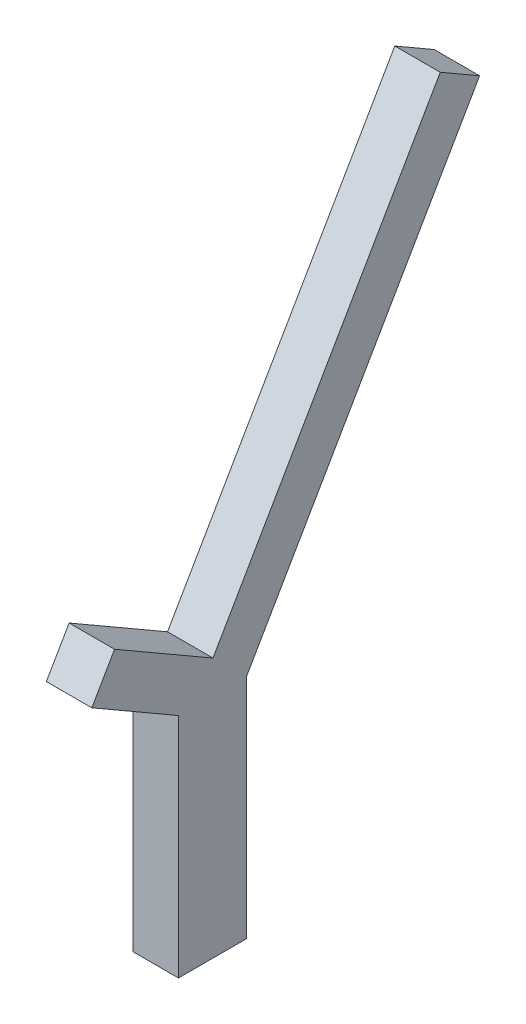
ISO-10303-21;
HEADER;
FILE_DESCRIPTION(('STEP AP214'),'2;1');
FILE_NAME('part.step','',(''),(''),'','','');
FILE_SCHEMA(('AUTOMOTIVE_DESIGN { 1 0 10303 214 1 1 1 1 }'));
ENDSEC;
DATA;
#1=APPLICATION_CONTEXT('core data for automotive mechanical design processes');
#2=APPLICATION_PROTOCOL_DEFINITION('international standard','automotive_design',2000,#1);
#3=PRODUCT_CONTEXT('',#1,'mechanical');
#4=PRODUCT('Part','Part','',(#3));
#5=PRODUCT_RELATED_PRODUCT_CATEGORY('part','',(#4));
#6=PRODUCT_DEFINITION_FORMATION('','',#4);
#7=PRODUCT_DEFINITION_CONTEXT('part definition',#1,'design');
#8=PRODUCT_DEFINITION('design','',#6,#7);
#9=PRODUCT_DEFINITION_SHAPE('','',#8);
#10=(LENGTH_UNIT() NAMED_UNIT(*) SI_UNIT(.MILLI.,.METRE.));
#11=(NAMED_UNIT(*) PLANE_ANGLE_UNIT() SI_UNIT($,.RADIAN.));
#12=(NAMED_UNIT(*) SI_UNIT($,.STERADIAN.) SOLID_ANGLE_UNIT());
#13=UNCERTAINTY_MEASURE_WITH_UNIT(LENGTH_MEASURE(1.E-05),#10,'distance_accuracy_value','');
#14=(GEOMETRIC_REPRESENTATION_CONTEXT(3) GLOBAL_UNCERTAINTY_ASSIGNED_CONTEXT((#13)) GLOBAL_UNIT_ASSIGNED_CONTEXT((#10,
#11,#12)) REPRESENTATION_CONTEXT('',''));
#15=CARTESIAN_POINT('',(0.,0.,0.));
#16=DIRECTION('',(0.,0.,1.));
#17=DIRECTION('',(1.,0.,0.));
#18=AXIS2_PLACEMENT_3D('',#15,#16,#17);
#19=CARTESIAN_POINT('',(10.,71.2768013397686,-49.277419261171));
#20=DIRECTION('',(0.,-0.86602540378444,0.499999999999998));
#21=DIRECTION('',(0.,-0.499999999999998,-0.86602540378444));
#22=AXIS2_PLACEMENT_3D('',#19,#20,#21);
#23=PLANE('',#22);
#24=DIRECTION('',(0.,0.499999999999998,0.86602540378444));
#25=VECTOR('',#24,1.);
#26=CARTESIAN_POINT('',(0.,71.2768013397686,-49.277419261171));
#27=LINE('',#26,#25);
#28=CARTESIAN_POINT('',(0.,71.2768013397686,-49.277419261171));
#29=VERTEX_POINT('',#28);
#30=CARTESIAN_POINT('',(0.,76.2768013397686,-40.6171652233266));
#31=VERTEX_POINT('',#30);
#32=EDGE_CURVE('E141',#29,#31,#27,.T.);
#33=ORIENTED_EDGE('',*,*,#32,.T.);
#34=DIRECTION('',(-1.,0.,0.));
#35=VECTOR('',#34,1.);
#36=CARTESIAN_POINT('',(10.,76.2768013397686,-40.6171652233266));
#37=LINE('',#36,#35);
#38=CARTESIAN_POINT('',(10.,76.2768013397686,-40.6171652233266));
#39=VERTEX_POINT('',#38);
#40=EDGE_CURVE('E11',#39,#31,#37,.T.);
#41=ORIENTED_EDGE('',*,*,#40,.F.);
#42=DIRECTION('',(0.,0.499999999999998,0.86602540378444));
#43=VECTOR('',#42,1.);
#44=CARTESIAN_POINT('',(10.,71.2768013397686,-49.277419261171));
#45=LINE('',#44,#43);
#46=CARTESIAN_POINT('',(10.,71.2768013397686,-49.277419261171));
#47=VERTEX_POINT('',#46);
#48=EDGE_CURVE('E157',#47,#39,#45,.T.);
#49=ORIENTED_EDGE('',*,*,#48,.F.);
#50=DIRECTION('',(-1.,0.,0.));
#51=VECTOR('',#50,1.);
#52=CARTESIAN_POINT('',(10.,71.2768013397686,-49.277419261171));
#53=LINE('',#52,#51);
#54=EDGE_CURVE('E137',#47,#29,#53,.T.);
#55=ORIENTED_EDGE('',*,*,#54,.T.);
#56=EDGE_LOOP('',(#33,#41,#49,#55));
#57=FACE_BOUND('',#56,.T.);
#58=ADVANCED_FACE('F39',(#57),#23,.F.);
#59=CARTESIAN_POINT('',(10.,76.2768013397686,-40.6171652233266));
#60=DIRECTION('',(0.,-0.499999999999997,-0.86602540378444));
#61=DIRECTION('',(0.,0.86602540378444,-0.499999999999997));
#62=AXIS2_PLACEMENT_3D('',#59,#60,#61);
#63=PLANE('',#62);
#64=DIRECTION('',(0.,-0.86602540378444,0.499999999999997));
#65=VECTOR('',#64,1.);
#66=CARTESIAN_POINT('',(0.,76.2768013397686,-40.6171652233266));
#67=LINE('',#66,#65);
#68=CARTESIAN_POINT('',(0.,-10.3257390386755,9.38283477667315));
#69=VERTEX_POINT('',#68);
#70=EDGE_CURVE('E144',#31,#69,#67,.T.);
#71=ORIENTED_EDGE('',*,*,#70,.T.);
#72=DIRECTION('',(-1.,0.,0.));
#73=VECTOR('',#72,1.);
#74=CARTESIAN_POINT('',(10.,-10.3257390386755,9.38283477667315));
#75=LINE('',#74,#73);
#76=CARTESIAN_POINT('',(10.,-10.3257390386755,9.38283477667315));
#77=VERTEX_POINT('',#76);
#78=EDGE_CURVE('E47',#77,#69,#75,.T.);
#79=ORIENTED_EDGE('',*,*,#78,.F.);
#80=DIRECTION('',(0.,-0.86602540378444,0.499999999999997));
#81=VECTOR('',#80,1.);
#82=CARTESIAN_POINT('',(10.,76.2768013397686,-40.6171652233266));
#83=LINE('',#82,#81);
#84=EDGE_CURVE('E101',#39,#77,#83,.T.);
#85=ORIENTED_EDGE('',*,*,#84,.F.);
#86=ORIENTED_EDGE('',*,*,#40,.T.);
#87=EDGE_LOOP('',(#71,#79,#85,#86));
#88=FACE_BOUND('',#87,.T.);
#89=ADVANCED_FACE('F200',(#88),#63,.F.);
#90=CARTESIAN_POINT('',(10.,-10.3257390386755,9.38283477667315));
#91=DIRECTION('',(0.,-0.86602540378444,0.499999999999998));
#92=DIRECTION('',(0.,-0.499999999999998,-0.86602540378444));
#93=AXIS2_PLACEMENT_3D('',#90,#91,#92);
#94=PLANE('',#93);
#95=DIRECTION('',(0.,0.499999999999997,0.86602540378444));
#96=VECTOR('',#95,1.);
#97=CARTESIAN_POINT('',(0.,-10.3257390386755,9.38283477667315));
#98=LINE('',#97,#96);
#99=CARTESIAN_POINT('',(0.,2.17426096132447,31.0334698712842));
#100=VERTEX_POINT('',#99);
#101=EDGE_CURVE('E146',#69,#100,#98,.T.);
#102=ORIENTED_EDGE('',*,*,#101,.T.);
#103=DIRECTION('',(-1.,0.,0.));
#104=VECTOR('',#103,1.);
#105=CARTESIAN_POINT('',(10.,2.17426096132447,31.0334698712842));
#106=LINE('',#105,#104);
#107=CARTESIAN_POINT('',(10.,2.17426096132447,31.0334698712842));
#108=VERTEX_POINT('',#107);
#109=EDGE_CURVE('E167',#108,#100,#106,.T.);
#110=ORIENTED_EDGE('',*,*,#109,.F.);
#111=DIRECTION('',(0.,0.499999999999997,0.86602540378444));
#112=VECTOR('',#111,1.);
#113=CARTESIAN_POINT('',(10.,-10.3257390386755,9.38283477667315));
#114=LINE('',#113,#112);
#115=EDGE_CURVE('E175',#77,#108,#114,.T.);
#116=ORIENTED_EDGE('',*,*,#115,.F.);
#117=ORIENTED_EDGE('',*,*,#78,.T.);
#118=EDGE_LOOP('',(#102,#110,#116,#117));
#119=FACE_BOUND('',#118,.T.);
#120=ADVANCED_FACE('F173',(#119),#94,.F.);
#121=CARTESIAN_POINT('',(10.,2.17426096132447,31.0334698712842));
#122=DIRECTION('',(0.,-0.499999999999997,-0.86602540378444));
#123=DIRECTION('',(0.,0.86602540378444,-0.499999999999997));
#124=AXIS2_PLACEMENT_3D('',#121,#122,#123);
#125=PLANE('',#124);
#126=DIRECTION('',(0.,-0.86602540378444,0.499999999999997));
#127=VECTOR('',#126,1.);
#128=CARTESIAN_POINT('',(0.,2.17426096132447,31.0334698712842));
#129=LINE('',#128,#127);
#130=CARTESIAN_POINT('',(0.,-6.48599307651993,36.0334698712841));
#131=VERTEX_POINT('',#130);
#132=EDGE_CURVE('E148',#100,#131,#129,.T.);
#133=ORIENTED_EDGE('',*,*,#132,.T.);
#134=DIRECTION('',(-1.,0.,0.));
#135=VECTOR('',#134,1.);
#136=CARTESIAN_POINT('',(10.,-6.48599307651993,36.0334698712841));
#137=LINE('',#136,#135);
#138=CARTESIAN_POINT('',(10.,-6.48599307651993,36.0334698712841));
#139=VERTEX_POINT('',#138);
#140=EDGE_CURVE('E164',#139,#131,#137,.T.);
#141=ORIENTED_EDGE('',*,*,#140,.F.);
#142=DIRECTION('',(0.,-0.86602540378444,0.499999999999997));
#143=VECTOR('',#142,1.);
#144=CARTESIAN_POINT('',(10.,2.17426096132447,31.0334698712842));
#145=LINE('',#144,#143);
#146=EDGE_CURVE('E191',#108,#139,#145,.T.);
#147=ORIENTED_EDGE('',*,*,#146,.F.);
#148=ORIENTED_EDGE('',*,*,#109,.T.);
#149=EDGE_LOOP('',(#133,#141,#147,#148));
#150=FACE_BOUND('',#149,.T.);
#151=ADVANCED_FACE('F184',(#150),#125,.F.);
#152=CARTESIAN_POINT('',(10.,-6.48599307651993,36.0334698712841));
#153=DIRECTION('',(0.,0.86602540378444,-0.499999999999998));
#154=DIRECTION('',(0.,0.499999999999998,0.86602540378444));
#155=AXIS2_PLACEMENT_3D('',#152,#153,#154);
#156=PLANE('',#155);
#157=DIRECTION('',(0.,-0.499999999999997,-0.86602540378444));
#158=VECTOR('',#157,1.);
#159=CARTESIAN_POINT('',(0.,-6.48599307651993,36.0334698712841));
#160=LINE('',#159,#158);
#161=CARTESIAN_POINT('',(0.,-17.4908025481366,16.9725807388288));
#162=VERTEX_POINT('',#161);
#163=EDGE_CURVE('E150',#131,#162,#160,.T.);
#164=ORIENTED_EDGE('',*,*,#163,.T.);
#165=DIRECTION('',(-1.,0.,0.));
#166=VECTOR('',#165,1.);
#167=CARTESIAN_POINT('',(10.,-17.4908025481366,16.9725807388288));
#168=LINE('',#167,#166);
#169=CARTESIAN_POINT('',(10.,-17.4908025481366,16.9725807388288));
#170=VERTEX_POINT('',#169);
#171=EDGE_CURVE('E161',#170,#162,#168,.T.);
#172=ORIENTED_EDGE('',*,*,#171,.F.);
#173=DIRECTION('',(0.,-0.499999999999997,-0.86602540378444));
#174=VECTOR('',#173,1.);
#175=CARTESIAN_POINT('',(10.,-6.48599307651993,36.0334698712841));
#176=LINE('',#175,#174);
#177=EDGE_CURVE('E190',#139,#170,#176,.T.);
#178=ORIENTED_EDGE('',*,*,#177,.F.);
#179=ORIENTED_EDGE('',*,*,#140,.T.);
#180=EDGE_LOOP('',(#164,#172,#178,#179));
#181=FACE_BOUND('',#180,.T.);
#182=ADVANCED_FACE('F188',(#181),#156,.F.);
#183=CARTESIAN_POINT('',(10.,-17.4908025481366,16.9725807388288));
#184=DIRECTION('',(0.,0.,-1.));
#185=DIRECTION('',(0.,1.,0.));
#186=AXIS2_PLACEMENT_3D('',#183,#184,#185);
#187=PLANE('',#186);
#188=DIRECTION('',(0.,-1.,0.));
#189=VECTOR('',#188,1.);
#190=CARTESIAN_POINT('',(0.,-17.4908025481366,16.9725807388288));
#191=LINE('',#190,#189);
#192=CARTESIAN_POINT('',(0.,-67.4908025481366,16.9725807388288));
#193=VERTEX_POINT('',#192);
#194=EDGE_CURVE('E152',#162,#193,#191,.T.);
#195=ORIENTED_EDGE('',*,*,#194,.T.);
#196=DIRECTION('',(-1.,0.,0.));
#197=VECTOR('',#196,1.);
#198=CARTESIAN_POINT('',(10.,-67.4908025481366,16.9725807388288));
#199=LINE('',#198,#197);
#200=CARTESIAN_POINT('',(10.,-67.4908025481366,16.9725807388288));
#201=VERTEX_POINT('',#200);
#202=EDGE_CURVE('E132',#201,#193,#199,.T.);
#203=ORIENTED_EDGE('',*,*,#202,.F.);
#204=DIRECTION('',(0.,-1.,0.));
#205=VECTOR('',#204,1.);
#206=CARTESIAN_POINT('',(10.,-17.4908025481366,16.9725807388288));
#207=LINE('',#206,#205);
#208=EDGE_CURVE('E123',#170,#201,#207,.T.);
#209=ORIENTED_EDGE('',*,*,#208,.F.);
#210=ORIENTED_EDGE('',*,*,#171,.T.);
#211=EDGE_LOOP('',(#195,#203,#209,#210));
#212=FACE_BOUND('',#211,.T.);
#213=ADVANCED_FACE('F212',(#212),#187,.F.);
#214=CARTESIAN_POINT('',(10.,-67.4908025481366,16.9725807388288));
#215=DIRECTION('',(0.,1.,0.));
#216=DIRECTION('',(0.,0.,1.));
#217=AXIS2_PLACEMENT_3D('',#214,#215,#216);
#218=PLANE('',#217);
#219=DIRECTION('',(0.,0.,-1.));
#220=VECTOR('',#219,1.);
#221=CARTESIAN_POINT('',(0.,-67.4908025481366,16.9725807388288));
#222=LINE('',#221,#220);
#223=CARTESIAN_POINT('',(0.,-67.4908025481366,1.97258073882876));
#224=VERTEX_POINT('',#223);
#225=EDGE_CURVE('E131',#193,#224,#222,.T.);
#226=ORIENTED_EDGE('',*,*,#225,.T.);
#227=DIRECTION('',(-1.,0.,0.));
#228=VECTOR('',#227,1.);
#229=CARTESIAN_POINT('',(10.,-67.4908025481366,1.97258073882876));
#230=LINE('',#229,#228);
#231=CARTESIAN_POINT('',(10.,-67.4908025481366,1.97258073882876));
#232=VERTEX_POINT('',#231);
#233=EDGE_CURVE('E128',#232,#224,#230,.T.);
#234=ORIENTED_EDGE('',*,*,#233,.F.);
#235=DIRECTION('',(0.,0.,-1.));
#236=VECTOR('',#235,1.);
#237=CARTESIAN_POINT('',(10.,-67.4908025481366,16.9725807388288));
#238=LINE('',#237,#236);
#239=EDGE_CURVE('E117',#201,#232,#238,.T.);
#240=ORIENTED_EDGE('',*,*,#239,.F.);
#241=ORIENTED_EDGE('',*,*,#202,.T.);
#242=EDGE_LOOP('',(#226,#234,#240,#241));
#243=FACE_BOUND('',#242,.T.);
#244=ADVANCED_FACE('F129',(#243),#218,.F.);
#245=CARTESIAN_POINT('',(10.,-67.4908025481366,1.97258073882876));
#246=DIRECTION('',(0.,0.,1.));
#247=DIRECTION('',(0.,-1.,0.));
#248=AXIS2_PLACEMENT_3D('',#245,#246,#247);
#249=PLANE('',#248);
#250=DIRECTION('',(0.,1.,0.));
#251=VECTOR('',#250,1.);
#252=CARTESIAN_POINT('',(0.,-67.4908025481366,1.97258073882876));
#253=LINE('',#252,#251);
#254=CARTESIAN_POINT('',(0.,-17.4908025481366,1.97258073882876));
#255=VERTEX_POINT('',#254);
#256=EDGE_CURVE('E87',#224,#255,#253,.T.);
#257=ORIENTED_EDGE('',*,*,#256,.T.);
#258=DIRECTION('',(-1.,0.,0.));
#259=VECTOR('',#258,1.);
#260=CARTESIAN_POINT('',(10.,-17.4908025481366,1.97258073882876));
#261=LINE('',#260,#259);
#262=CARTESIAN_POINT('',(10.,-17.4908025481366,1.97258073882876));
#263=VERTEX_POINT('',#262);
#264=EDGE_CURVE('E133',#263,#255,#261,.T.);
#265=ORIENTED_EDGE('',*,*,#264,.F.);
#266=DIRECTION('',(0.,1.,0.));
#267=VECTOR('',#266,1.);
#268=CARTESIAN_POINT('',(10.,-67.4908025481366,1.97258073882876));
#269=LINE('',#268,#267);
#270=EDGE_CURVE('E121',#232,#263,#269,.T.);
#271=ORIENTED_EDGE('',*,*,#270,.F.);
#272=ORIENTED_EDGE('',*,*,#233,.T.);
#273=EDGE_LOOP('',(#257,#265,#271,#272));
#274=FACE_BOUND('',#273,.T.);
#275=ADVANCED_FACE('F135',(#274),#249,.F.);
#276=CARTESIAN_POINT('',(10.,-17.4908025481366,1.97258073882876));
#277=DIRECTION('',(0.,0.499999999999998,0.86602540378444));
#278=DIRECTION('',(0.,-0.86602540378444,0.499999999999998));
#279=AXIS2_PLACEMENT_3D('',#276,#277,#278);
#280=PLANE('',#279);
#281=DIRECTION('',(0.,0.86602540378444,-0.499999999999998));
#282=VECTOR('',#281,1.);
#283=CARTESIAN_POINT('',(0.,-17.4908025481366,1.97258073882876));
#284=LINE('',#283,#282);
#285=EDGE_CURVE('E93',#255,#29,#284,.T.);
#286=ORIENTED_EDGE('',*,*,#285,.T.);
#287=ORIENTED_EDGE('',*,*,#54,.F.);
#288=DIRECTION('',(0.,0.86602540378444,-0.499999999999998));
#289=VECTOR('',#288,1.);
#290=CARTESIAN_POINT('',(10.,-17.4908025481366,1.97258073882876));
#291=LINE('',#290,#289);
#292=EDGE_CURVE('E55',#263,#47,#291,.T.);
#293=ORIENTED_EDGE('',*,*,#292,.F.);
#294=ORIENTED_EDGE('',*,*,#264,.T.);
#295=EDGE_LOOP('',(#286,#287,#293,#294));
#296=FACE_BOUND('',#295,.T.);
#297=ADVANCED_FACE('F220',(#296),#280,.F.);
#298=CARTESIAN_POINT('',(10.,0.,0.));
#299=DIRECTION('',(1.,0.,0.));
#300=DIRECTION('',(0.,0.,-1.));
#301=AXIS2_PLACEMENT_3D('',#298,#299,#300);
#302=PLANE('',#301);
#303=ORIENTED_EDGE('',*,*,#48,.T.);
#304=ORIENTED_EDGE('',*,*,#84,.T.);
#305=ORIENTED_EDGE('',*,*,#115,.T.);
#306=ORIENTED_EDGE('',*,*,#146,.T.);
#307=ORIENTED_EDGE('',*,*,#177,.T.);
#308=ORIENTED_EDGE('',*,*,#208,.T.);
#309=ORIENTED_EDGE('',*,*,#239,.T.);
#310=ORIENTED_EDGE('',*,*,#270,.T.);
#311=ORIENTED_EDGE('',*,*,#292,.T.);
#312=EDGE_LOOP('',(#303,#304,#305,#306,#307,#308,#309,#310,#311));
#313=FACE_BOUND('',#312,.T.);
#314=ADVANCED_FACE('F119',(#313),#302,.T.);
#315=CARTESIAN_POINT('',(0.,0.,0.));
#316=DIRECTION('',(1.,0.,0.));
#317=DIRECTION('',(0.,0.,-1.));
#318=AXIS2_PLACEMENT_3D('',#315,#316,#317);
#319=PLANE('',#318);
#320=ORIENTED_EDGE('',*,*,#32,.F.);
#321=ORIENTED_EDGE('',*,*,#285,.F.);
#322=ORIENTED_EDGE('',*,*,#256,.F.);
#323=ORIENTED_EDGE('',*,*,#225,.F.);
#324=ORIENTED_EDGE('',*,*,#194,.F.);
#325=ORIENTED_EDGE('',*,*,#163,.F.);
#326=ORIENTED_EDGE('',*,*,#132,.F.);
#327=ORIENTED_EDGE('',*,*,#101,.F.);
#328=ORIENTED_EDGE('',*,*,#70,.F.);
#329=EDGE_LOOP('',(#320,#321,#322,#323,#324,#325,#326,#327,#328));
#330=FACE_BOUND('',#329,.T.);
#331=ADVANCED_FACE('F179',(#330),#319,.F.);
#332=CLOSED_SHELL('',(#58,#89,#120,#151,#182,#213,#244,#275,#297,#314,#331));
#333=MANIFOLD_SOLID_BREP('B2',#332);
#334=ADVANCED_BREP_SHAPE_REPRESENTATION('',(#18,#333),#14);
#335=SHAPE_DEFINITION_REPRESENTATION(#9,#334);
ENDSEC;
END-ISO-10303-21;
